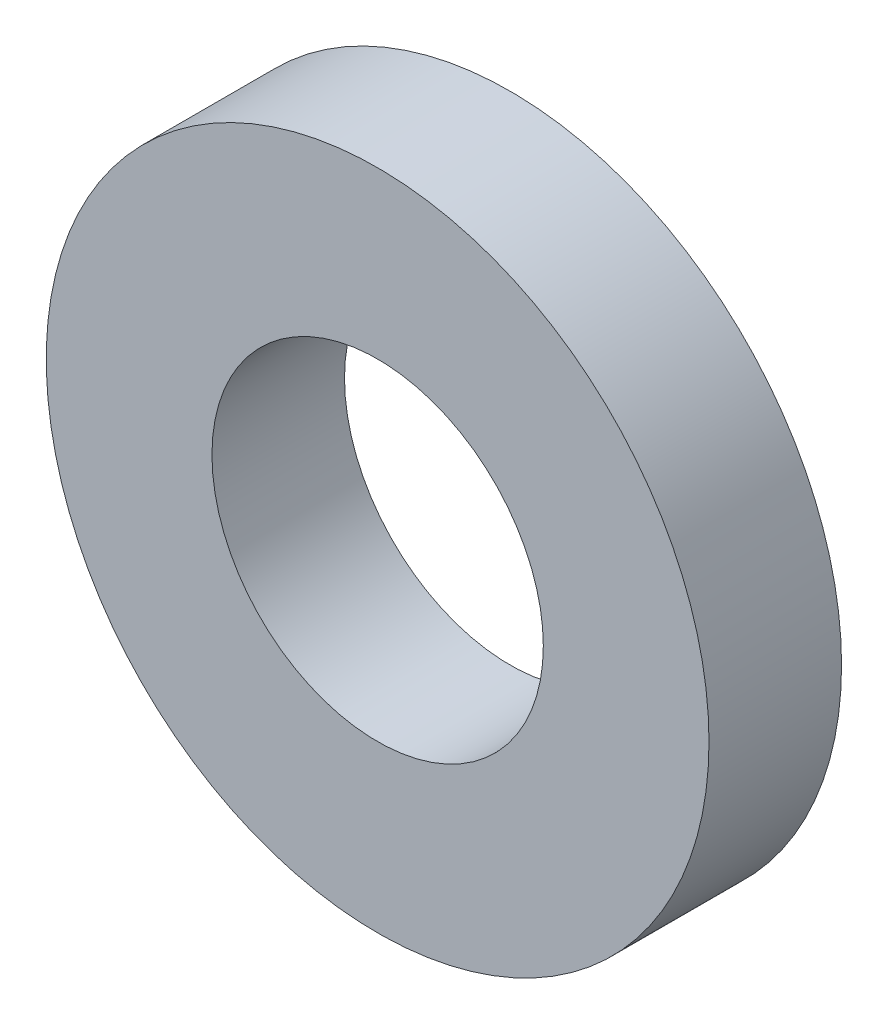
ISO-10303-21;
HEADER;
FILE_DESCRIPTION(('STEP AP214'),'2;1');
FILE_NAME('part.step','',(''),(''),'','','');
FILE_SCHEMA(('AUTOMOTIVE_DESIGN { 1 0 10303 214 1 1 1 1 }'));
ENDSEC;
DATA;
#1=APPLICATION_CONTEXT('core data for automotive mechanical design processes');
#2=APPLICATION_PROTOCOL_DEFINITION('international standard','automotive_design',2000,#1);
#3=PRODUCT_CONTEXT('',#1,'mechanical');
#4=PRODUCT('Part','Part','',(#3));
#5=PRODUCT_RELATED_PRODUCT_CATEGORY('part','',(#4));
#6=PRODUCT_DEFINITION_FORMATION('','',#4);
#7=PRODUCT_DEFINITION_CONTEXT('part definition',#1,'design');
#8=PRODUCT_DEFINITION('design','',#6,#7);
#9=PRODUCT_DEFINITION_SHAPE('','',#8);
#10=(LENGTH_UNIT() NAMED_UNIT(*) SI_UNIT(.MILLI.,.METRE.));
#11=(NAMED_UNIT(*) PLANE_ANGLE_UNIT() SI_UNIT($,.RADIAN.));
#12=(NAMED_UNIT(*) SI_UNIT($,.STERADIAN.) SOLID_ANGLE_UNIT());
#13=UNCERTAINTY_MEASURE_WITH_UNIT(LENGTH_MEASURE(1.E-05),#10,'distance_accuracy_value','');
#14=(GEOMETRIC_REPRESENTATION_CONTEXT(3) GLOBAL_UNCERTAINTY_ASSIGNED_CONTEXT((#13)) GLOBAL_UNIT_ASSIGNED_CONTEXT((#10,
#11,#12)) REPRESENTATION_CONTEXT('',''));
#15=CARTESIAN_POINT('',(0.,0.,0.));
#16=DIRECTION('',(0.,0.,1.));
#17=DIRECTION('',(1.,0.,0.));
#18=AXIS2_PLACEMENT_3D('',#15,#16,#17);
#19=CARTESIAN_POINT('',(0.,0.,2.));
#20=DIRECTION('',(0.,0.,1.));
#21=DIRECTION('',(1.,0.,0.));
#22=AXIS2_PLACEMENT_3D('',#19,#20,#21);
#23=PLANE('',#22);
#24=CARTESIAN_POINT('',(0.,0.,2.));
#25=DIRECTION('',(0.,0.,1.));
#26=DIRECTION('',(1.,0.,0.));
#27=AXIS2_PLACEMENT_3D('',#24,#25,#26);
#28=CIRCLE('',#27,5.);
#29=CARTESIAN_POINT('',(5.,0.,2.));
#30=VERTEX_POINT('',#29);
#31=EDGE_CURVE('E10',#30,#30,#28,.T.);
#32=ORIENTED_EDGE('',*,*,#31,.T.);
#33=EDGE_LOOP('',(#32));
#34=FACE_BOUND('',#33,.T.);
#35=CARTESIAN_POINT('',(0.,0.,2.));
#36=DIRECTION('',(0.,0.,1.));
#37=DIRECTION('',(1.,0.,0.));
#38=AXIS2_PLACEMENT_3D('',#35,#36,#37);
#39=CIRCLE('',#38,2.5);
#40=CARTESIAN_POINT('',(2.5,0.,2.));
#41=VERTEX_POINT('',#40);
#42=EDGE_CURVE('E50',#41,#41,#39,.T.);
#43=ORIENTED_EDGE('',*,*,#42,.F.);
#44=EDGE_LOOP('',(#43));
#45=FACE_BOUND('',#44,.T.);
#46=ADVANCED_FACE('F37',(#34,#45),#23,.T.);
#47=CARTESIAN_POINT('',(0.,0.,0.));
#48=DIRECTION('',(0.,0.,1.));
#49=DIRECTION('',(1.,0.,0.));
#50=AXIS2_PLACEMENT_3D('',#47,#48,#49);
#51=PLANE('',#50);
#52=CARTESIAN_POINT('',(0.,0.,0.));
#53=DIRECTION('',(0.,0.,1.));
#54=DIRECTION('',(1.,0.,0.));
#55=AXIS2_PLACEMENT_3D('',#52,#53,#54);
#56=CIRCLE('',#55,5.);
#57=CARTESIAN_POINT('',(5.,0.,0.));
#58=VERTEX_POINT('',#57);
#59=EDGE_CURVE('E41',#58,#58,#56,.T.);
#60=ORIENTED_EDGE('',*,*,#59,.F.);
#61=EDGE_LOOP('',(#60));
#62=FACE_BOUND('',#61,.T.);
#63=CARTESIAN_POINT('',(0.,0.,0.));
#64=DIRECTION('',(0.,0.,1.));
#65=DIRECTION('',(1.,0.,0.));
#66=AXIS2_PLACEMENT_3D('',#63,#64,#65);
#67=CIRCLE('',#66,2.5);
#68=CARTESIAN_POINT('',(2.5,0.,0.));
#69=VERTEX_POINT('',#68);
#70=EDGE_CURVE('E52',#69,#69,#67,.T.);
#71=ORIENTED_EDGE('',*,*,#70,.T.);
#72=EDGE_LOOP('',(#71));
#73=FACE_BOUND('',#72,.T.);
#74=ADVANCED_FACE('F64',(#62,#73),#51,.F.);
#75=CARTESIAN_POINT('',(0.,0.,2.));
#76=DIRECTION('',(0.,0.,-1.));
#77=DIRECTION('',(-1.,0.,0.));
#78=AXIS2_PLACEMENT_3D('',#75,#76,#77);
#79=CYLINDRICAL_SURFACE('',#78,5.);
#80=ORIENTED_EDGE('',*,*,#31,.F.);
#81=EDGE_LOOP('',(#80));
#82=FACE_BOUND('',#81,.T.);
#83=ORIENTED_EDGE('',*,*,#59,.T.);
#84=EDGE_LOOP('',(#83));
#85=FACE_BOUND('',#84,.T.);
#86=ADVANCED_FACE('F39',(#82,#85),#79,.T.);
#87=CARTESIAN_POINT('',(0.,0.,2.));
#88=DIRECTION('',(0.,0.,-1.));
#89=DIRECTION('',(-1.,0.,0.));
#90=AXIS2_PLACEMENT_3D('',#87,#88,#89);
#91=CYLINDRICAL_SURFACE('',#90,2.5);
#92=ORIENTED_EDGE('',*,*,#42,.T.);
#93=EDGE_LOOP('',(#92));
#94=FACE_BOUND('',#93,.T.);
#95=ORIENTED_EDGE('',*,*,#70,.F.);
#96=EDGE_LOOP('',(#95));
#97=FACE_BOUND('',#96,.T.);
#98=ADVANCED_FACE('F60',(#94,#97),#91,.F.);
#99=CLOSED_SHELL('',(#46,#74,#86,#98));
#100=MANIFOLD_SOLID_BREP('B2',#99);
#101=ADVANCED_BREP_SHAPE_REPRESENTATION('',(#18,#100),#14);
#102=SHAPE_DEFINITION_REPRESENTATION(#9,#101);
ENDSEC;
END-ISO-10303-21;
